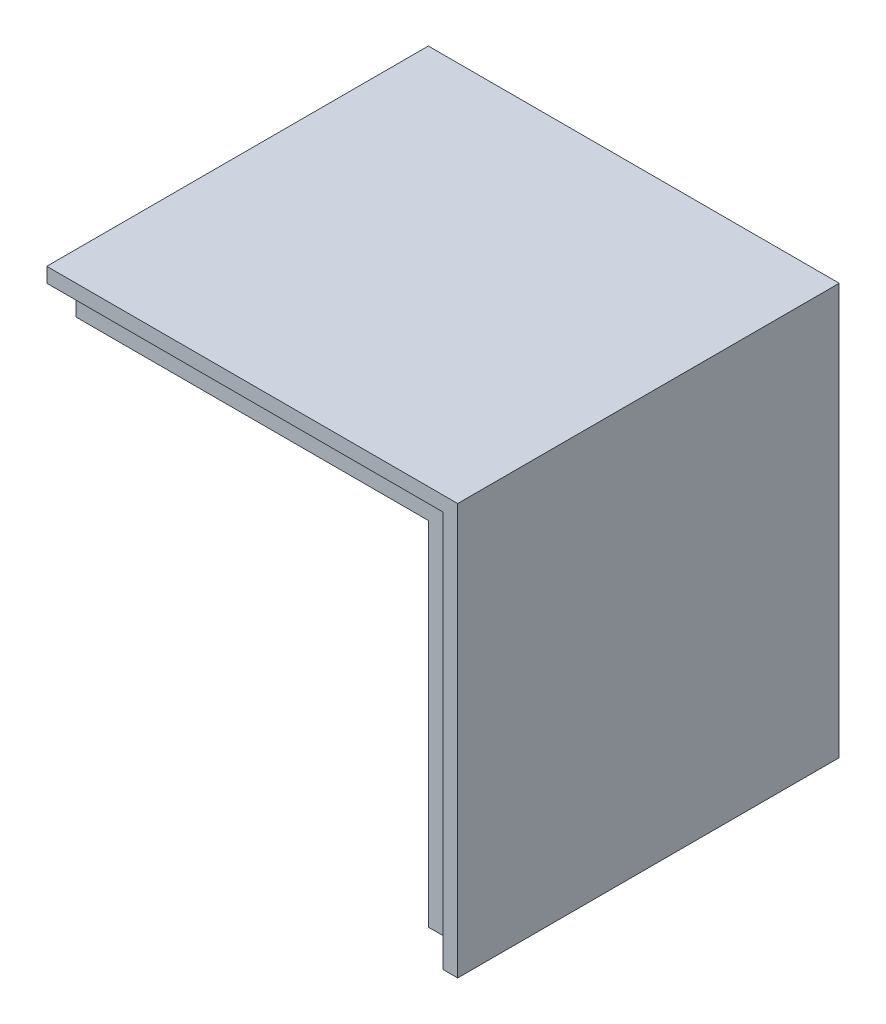
ISO-10303-21;
HEADER;
FILE_DESCRIPTION(('STEP AP214'),'2;1');
FILE_NAME('part.step','',(''),(''),'','','');
FILE_SCHEMA(('AUTOMOTIVE_DESIGN { 1 0 10303 214 1 1 1 1 }'));
ENDSEC;
DATA;
#1=APPLICATION_CONTEXT('core data for automotive mechanical design processes');
#2=APPLICATION_PROTOCOL_DEFINITION('international standard','automotive_design',2000,#1);
#3=PRODUCT_CONTEXT('',#1,'mechanical');
#4=PRODUCT('Part','Part','',(#3));
#5=PRODUCT_RELATED_PRODUCT_CATEGORY('part','',(#4));
#6=PRODUCT_DEFINITION_FORMATION('','',#4);
#7=PRODUCT_DEFINITION_CONTEXT('part definition',#1,'design');
#8=PRODUCT_DEFINITION('design','',#6,#7);
#9=PRODUCT_DEFINITION_SHAPE('','',#8);
#10=(LENGTH_UNIT() NAMED_UNIT(*) SI_UNIT(.MILLI.,.METRE.));
#11=(NAMED_UNIT(*) PLANE_ANGLE_UNIT() SI_UNIT($,.RADIAN.));
#12=(NAMED_UNIT(*) SI_UNIT($,.STERADIAN.) SOLID_ANGLE_UNIT());
#13=UNCERTAINTY_MEASURE_WITH_UNIT(LENGTH_MEASURE(1.E-05),#10,'distance_accuracy_value','');
#14=(GEOMETRIC_REPRESENTATION_CONTEXT(3) GLOBAL_UNCERTAINTY_ASSIGNED_CONTEXT((#13)) GLOBAL_UNIT_ASSIGNED_CONTEXT((#10,
#11,#12)) REPRESENTATION_CONTEXT('',''));
#15=CARTESIAN_POINT('',(0.,0.,0.));
#16=DIRECTION('',(0.,0.,1.));
#17=DIRECTION('',(1.,0.,0.));
#18=AXIS2_PLACEMENT_3D('',#15,#16,#17);
#19=CARTESIAN_POINT('',(-70.,67.5,65.));
#20=DIRECTION('',(1.,0.,0.));
#21=DIRECTION('',(0.,0.,-1.));
#22=AXIS2_PLACEMENT_3D('',#19,#20,#21);
#23=PLANE('',#22);
#24=DIRECTION('',(0.,-1.,0.));
#25=VECTOR('',#24,1.);
#26=CARTESIAN_POINT('',(-70.,67.5,-65.));
#27=LINE('',#26,#25);
#28=CARTESIAN_POINT('',(-70.,72.5,-65.));
#29=VERTEX_POINT('',#28);
#30=CARTESIAN_POINT('',(-70.,67.5,-65.));
#31=VERTEX_POINT('',#30);
#32=EDGE_CURVE('E169',#29,#31,#27,.T.);
#33=ORIENTED_EDGE('',*,*,#32,.T.);
#34=DIRECTION('',(0.,0.,-1.));
#35=VECTOR('',#34,1.);
#36=CARTESIAN_POINT('',(-70.,67.5,65.));
#37=LINE('',#36,#35);
#38=CARTESIAN_POINT('',(-70.,67.5,65.));
#39=VERTEX_POINT('',#38);
#40=EDGE_CURVE('E11',#39,#31,#37,.T.);
#41=ORIENTED_EDGE('',*,*,#40,.F.);
#42=DIRECTION('',(0.,-1.,0.));
#43=VECTOR('',#42,1.);
#44=CARTESIAN_POINT('',(-70.,67.5,65.));
#45=LINE('',#44,#43);
#46=CARTESIAN_POINT('',(-70.,72.5,65.));
#47=VERTEX_POINT('',#46);
#48=EDGE_CURVE('E170',#47,#39,#45,.T.);
#49=ORIENTED_EDGE('',*,*,#48,.F.);
#50=DIRECTION('',(0.,0.,-1.));
#51=VECTOR('',#50,1.);
#52=CARTESIAN_POINT('',(-70.,72.5,65.));
#53=LINE('',#52,#51);
#54=EDGE_CURVE('E184',#47,#29,#53,.T.);
#55=ORIENTED_EDGE('',*,*,#54,.T.);
#56=EDGE_LOOP('',(#33,#41,#49,#55));
#57=FACE_BOUND('',#56,.T.);
#58=ADVANCED_FACE('F33',(#57),#23,.F.);
#59=CARTESIAN_POINT('',(65.,67.5,65.));
#60=DIRECTION('',(0.,1.,0.));
#61=DIRECTION('',(-1.,0.,0.));
#62=AXIS2_PLACEMENT_3D('',#59,#60,#61);
#63=PLANE('',#62);
#64=DIRECTION('',(0.,0.,-1.));
#65=VECTOR('',#64,1.);
#66=CARTESIAN_POINT('',(-65.,67.5,60.));
#67=LINE('',#66,#65);
#68=CARTESIAN_POINT('',(-65.,67.5,60.));
#69=VERTEX_POINT('',#68);
#70=CARTESIAN_POINT('',(-65.,67.5,-60.));
#71=VERTEX_POINT('',#70);
#72=EDGE_CURVE('E47',#69,#71,#67,.T.);
#73=ORIENTED_EDGE('',*,*,#72,.F.);
#74=DIRECTION('',(-1.,0.,0.));
#75=VECTOR('',#74,1.);
#76=CARTESIAN_POINT('',(65.,67.5,60.));
#77=LINE('',#76,#75);
#78=CARTESIAN_POINT('',(65.,67.5,60.));
#79=VERTEX_POINT('',#78);
#80=EDGE_CURVE('E127',#79,#69,#77,.T.);
#81=ORIENTED_EDGE('',*,*,#80,.F.);
#82=DIRECTION('',(0.,0.,-1.));
#83=VECTOR('',#82,1.);
#84=CARTESIAN_POINT('',(65.,67.5,65.));
#85=LINE('',#84,#83);
#86=CARTESIAN_POINT('',(65.,67.5,65.));
#87=VERTEX_POINT('',#86);
#88=EDGE_CURVE('E40',#87,#79,#85,.T.);
#89=ORIENTED_EDGE('',*,*,#88,.F.);
#90=DIRECTION('',(1.,0.,0.));
#91=VECTOR('',#90,1.);
#92=CARTESIAN_POINT('',(65.,67.5,65.));
#93=LINE('',#92,#91);
#94=EDGE_CURVE('E173',#39,#87,#93,.T.);
#95=ORIENTED_EDGE('',*,*,#94,.F.);
#96=ORIENTED_EDGE('',*,*,#40,.T.);
#97=DIRECTION('',(1.,0.,0.));
#98=VECTOR('',#97,1.);
#99=CARTESIAN_POINT('',(65.,67.5,-65.));
#100=LINE('',#99,#98);
#101=CARTESIAN_POINT('',(65.,67.5,-65.));
#102=VERTEX_POINT('',#101);
#103=EDGE_CURVE('E187',#31,#102,#100,.T.);
#104=ORIENTED_EDGE('',*,*,#103,.T.);
#105=CARTESIAN_POINT('',(65.,67.5,-60.));
#106=VERTEX_POINT('',#105);
#107=EDGE_CURVE('E207',#106,#102,#85,.T.);
#108=ORIENTED_EDGE('',*,*,#107,.F.);
#109=DIRECTION('',(-1.,0.,0.));
#110=VECTOR('',#109,1.);
#111=CARTESIAN_POINT('',(65.,67.5,-60.));
#112=LINE('',#111,#110);
#113=EDGE_CURVE('E52',#106,#71,#112,.T.);
#114=ORIENTED_EDGE('',*,*,#113,.T.);
#115=EDGE_LOOP('',(#73,#81,#89,#95,#96,#104,#108,#114));
#116=FACE_BOUND('',#115,.T.);
#117=ADVANCED_FACE('F216',(#116),#63,.F.);
#118=CARTESIAN_POINT('',(65.,-67.5,65.));
#119=DIRECTION('',(1.,0.,0.));
#120=DIRECTION('',(0.,0.,-1.));
#121=AXIS2_PLACEMENT_3D('',#118,#119,#120);
#122=PLANE('',#121);
#123=ORIENTED_EDGE('',*,*,#88,.T.);
#124=DIRECTION('',(0.,1.,0.));
#125=VECTOR('',#124,1.);
#126=CARTESIAN_POINT('',(65.,-62.5,60.));
#127=LINE('',#126,#125);
#128=CARTESIAN_POINT('',(65.,-62.5,60.));
#129=VERTEX_POINT('',#128);
#130=EDGE_CURVE('E149',#129,#79,#127,.T.);
#131=ORIENTED_EDGE('',*,*,#130,.F.);
#132=DIRECTION('',(0.,0.,-1.));
#133=VECTOR('',#132,1.);
#134=CARTESIAN_POINT('',(65.,-62.5,60.));
#135=LINE('',#134,#133);
#136=CARTESIAN_POINT('',(65.,-62.5,-60.));
#137=VERTEX_POINT('',#136);
#138=EDGE_CURVE('E151',#129,#137,#135,.T.);
#139=ORIENTED_EDGE('',*,*,#138,.T.);
#140=DIRECTION('',(0.,1.,0.));
#141=VECTOR('',#140,1.);
#142=CARTESIAN_POINT('',(65.,-62.5,-60.));
#143=LINE('',#142,#141);
#144=EDGE_CURVE('E161',#137,#106,#143,.T.);
#145=ORIENTED_EDGE('',*,*,#144,.T.);
#146=ORIENTED_EDGE('',*,*,#107,.T.);
#147=DIRECTION('',(0.,-1.,0.));
#148=VECTOR('',#147,1.);
#149=CARTESIAN_POINT('',(65.,-67.5,-65.));
#150=LINE('',#149,#148);
#151=CARTESIAN_POINT('',(65.,-67.5,-65.));
#152=VERTEX_POINT('',#151);
#153=EDGE_CURVE('E190',#102,#152,#150,.T.);
#154=ORIENTED_EDGE('',*,*,#153,.T.);
#155=DIRECTION('',(0.,0.,-1.));
#156=VECTOR('',#155,1.);
#157=CARTESIAN_POINT('',(65.,-67.5,65.));
#158=LINE('',#157,#156);
#159=CARTESIAN_POINT('',(65.,-67.5,65.));
#160=VERTEX_POINT('',#159);
#161=EDGE_CURVE('E205',#160,#152,#158,.T.);
#162=ORIENTED_EDGE('',*,*,#161,.F.);
#163=DIRECTION('',(0.,-1.,0.));
#164=VECTOR('',#163,1.);
#165=CARTESIAN_POINT('',(65.,-67.5,65.));
#166=LINE('',#165,#164);
#167=EDGE_CURVE('E176',#87,#160,#166,.T.);
#168=ORIENTED_EDGE('',*,*,#167,.F.);
#169=EDGE_LOOP('',(#123,#131,#139,#145,#146,#154,#162,#168));
#170=FACE_BOUND('',#169,.T.);
#171=ADVANCED_FACE('F212',(#170),#122,.F.);
#172=CARTESIAN_POINT('',(70.,-67.5,65.));
#173=DIRECTION('',(0.,1.,0.));
#174=DIRECTION('',(0.,0.,1.));
#175=AXIS2_PLACEMENT_3D('',#172,#173,#174);
#176=PLANE('',#175);
#177=DIRECTION('',(1.,0.,0.));
#178=VECTOR('',#177,1.);
#179=CARTESIAN_POINT('',(70.,-67.5,-65.));
#180=LINE('',#179,#178);
#181=CARTESIAN_POINT('',(70.,-67.5,-65.));
#182=VERTEX_POINT('',#181);
#183=EDGE_CURVE('E192',#152,#182,#180,.T.);
#184=ORIENTED_EDGE('',*,*,#183,.T.);
#185=DIRECTION('',(0.,0.,-1.));
#186=VECTOR('',#185,1.);
#187=CARTESIAN_POINT('',(70.,-67.5,65.));
#188=LINE('',#187,#186);
#189=CARTESIAN_POINT('',(70.,-67.5,65.));
#190=VERTEX_POINT('',#189);
#191=EDGE_CURVE('E202',#190,#182,#188,.T.);
#192=ORIENTED_EDGE('',*,*,#191,.F.);
#193=DIRECTION('',(1.,0.,0.));
#194=VECTOR('',#193,1.);
#195=CARTESIAN_POINT('',(70.,-67.5,65.));
#196=LINE('',#195,#194);
#197=EDGE_CURVE('E178',#160,#190,#196,.T.);
#198=ORIENTED_EDGE('',*,*,#197,.F.);
#199=ORIENTED_EDGE('',*,*,#161,.T.);
#200=EDGE_LOOP('',(#184,#192,#198,#199));
#201=FACE_BOUND('',#200,.T.);
#202=ADVANCED_FACE('F226',(#201),#176,.F.);
#203=CARTESIAN_POINT('',(70.,72.5,65.));
#204=DIRECTION('',(-1.,0.,0.));
#205=DIRECTION('',(0.,0.,1.));
#206=AXIS2_PLACEMENT_3D('',#203,#204,#205);
#207=PLANE('',#206);
#208=DIRECTION('',(0.,1.,0.));
#209=VECTOR('',#208,1.);
#210=CARTESIAN_POINT('',(70.,72.5,-65.));
#211=LINE('',#210,#209);
#212=CARTESIAN_POINT('',(70.,72.5,-65.));
#213=VERTEX_POINT('',#212);
#214=EDGE_CURVE('E194',#182,#213,#211,.T.);
#215=ORIENTED_EDGE('',*,*,#214,.T.);
#216=DIRECTION('',(0.,0.,-1.));
#217=VECTOR('',#216,1.);
#218=CARTESIAN_POINT('',(70.,72.5,65.));
#219=LINE('',#218,#217);
#220=CARTESIAN_POINT('',(70.,72.5,65.));
#221=VERTEX_POINT('',#220);
#222=EDGE_CURVE('E199',#221,#213,#219,.T.);
#223=ORIENTED_EDGE('',*,*,#222,.F.);
#224=DIRECTION('',(0.,1.,0.));
#225=VECTOR('',#224,1.);
#226=CARTESIAN_POINT('',(70.,72.5,65.));
#227=LINE('',#226,#225);
#228=EDGE_CURVE('E180',#190,#221,#227,.T.);
#229=ORIENTED_EDGE('',*,*,#228,.F.);
#230=ORIENTED_EDGE('',*,*,#191,.T.);
#231=EDGE_LOOP('',(#215,#223,#229,#230));
#232=FACE_BOUND('',#231,.T.);
#233=ADVANCED_FACE('F230',(#232),#207,.F.);
#234=CARTESIAN_POINT('',(-70.,72.5,65.));
#235=DIRECTION('',(0.,-1.,0.));
#236=DIRECTION('',(1.,0.,0.));
#237=AXIS2_PLACEMENT_3D('',#234,#235,#236);
#238=PLANE('',#237);
#239=DIRECTION('',(-1.,0.,0.));
#240=VECTOR('',#239,1.);
#241=CARTESIAN_POINT('',(-70.,72.5,-65.));
#242=LINE('',#241,#240);
#243=EDGE_CURVE('E174',#213,#29,#242,.T.);
#244=ORIENTED_EDGE('',*,*,#243,.T.);
#245=ORIENTED_EDGE('',*,*,#54,.F.);
#246=DIRECTION('',(-1.,0.,0.));
#247=VECTOR('',#246,1.);
#248=CARTESIAN_POINT('',(-70.,72.5,65.));
#249=LINE('',#248,#247);
#250=EDGE_CURVE('E182',#221,#47,#249,.T.);
#251=ORIENTED_EDGE('',*,*,#250,.F.);
#252=ORIENTED_EDGE('',*,*,#222,.T.);
#253=EDGE_LOOP('',(#244,#245,#251,#252));
#254=FACE_BOUND('',#253,.T.);
#255=ADVANCED_FACE('F239',(#254),#238,.F.);
#256=CARTESIAN_POINT('',(0.,0.,65.));
#257=DIRECTION('',(0.,0.,-1.));
#258=DIRECTION('',(-1.,0.,0.));
#259=AXIS2_PLACEMENT_3D('',#256,#257,#258);
#260=PLANE('',#259);
#261=ORIENTED_EDGE('',*,*,#48,.T.);
#262=ORIENTED_EDGE('',*,*,#94,.T.);
#263=ORIENTED_EDGE('',*,*,#167,.T.);
#264=ORIENTED_EDGE('',*,*,#197,.T.);
#265=ORIENTED_EDGE('',*,*,#228,.T.);
#266=ORIENTED_EDGE('',*,*,#250,.T.);
#267=EDGE_LOOP('',(#261,#262,#263,#264,#265,#266));
#268=FACE_BOUND('',#267,.T.);
#269=ADVANCED_FACE('F234',(#268),#260,.F.);
#270=CARTESIAN_POINT('',(0.,0.,-65.));
#271=DIRECTION('',(0.,0.,-1.));
#272=DIRECTION('',(-1.,0.,0.));
#273=AXIS2_PLACEMENT_3D('',#270,#271,#272);
#274=PLANE('',#273);
#275=ORIENTED_EDGE('',*,*,#32,.F.);
#276=ORIENTED_EDGE('',*,*,#243,.F.);
#277=ORIENTED_EDGE('',*,*,#214,.F.);
#278=ORIENTED_EDGE('',*,*,#183,.F.);
#279=ORIENTED_EDGE('',*,*,#153,.F.);
#280=ORIENTED_EDGE('',*,*,#103,.F.);
#281=EDGE_LOOP('',(#275,#276,#277,#278,#279,#280));
#282=FACE_BOUND('',#281,.T.);
#283=ADVANCED_FACE('F221',(#282),#274,.T.);
#284=CARTESIAN_POINT('',(-65.,67.5,60.));
#285=DIRECTION('',(1.,0.,0.));
#286=DIRECTION('',(0.,0.,-1.));
#287=AXIS2_PLACEMENT_3D('',#284,#285,#286);
#288=PLANE('',#287);
#289=DIRECTION('',(0.,-1.,0.));
#290=VECTOR('',#289,1.);
#291=CARTESIAN_POINT('',(-65.,67.5,-60.));
#292=LINE('',#291,#290);
#293=CARTESIAN_POINT('',(-65.,57.5,-60.));
#294=VERTEX_POINT('',#293);
#295=EDGE_CURVE('E133',#71,#294,#292,.T.);
#296=ORIENTED_EDGE('',*,*,#295,.T.);
#297=DIRECTION('',(0.,0.,-1.));
#298=VECTOR('',#297,1.);
#299=CARTESIAN_POINT('',(-65.,57.5,60.));
#300=LINE('',#299,#298);
#301=CARTESIAN_POINT('',(-65.,57.5,60.));
#302=VERTEX_POINT('',#301);
#303=EDGE_CURVE('E131',#302,#294,#300,.T.);
#304=ORIENTED_EDGE('',*,*,#303,.F.);
#305=DIRECTION('',(0.,-1.,0.));
#306=VECTOR('',#305,1.);
#307=CARTESIAN_POINT('',(-65.,67.5,60.));
#308=LINE('',#307,#306);
#309=EDGE_CURVE('E120',#69,#302,#308,.T.);
#310=ORIENTED_EDGE('',*,*,#309,.F.);
#311=ORIENTED_EDGE('',*,*,#72,.T.);
#312=EDGE_LOOP('',(#296,#304,#310,#311));
#313=FACE_BOUND('',#312,.T.);
#314=ADVANCED_FACE('F132',(#313),#288,.F.);
#315=CARTESIAN_POINT('',(-65.,57.5,60.));
#316=DIRECTION('',(0.,1.,0.));
#317=DIRECTION('',(-1.,0.,0.));
#318=AXIS2_PLACEMENT_3D('',#315,#316,#317);
#319=PLANE('',#318);
#320=DIRECTION('',(1.,0.,0.));
#321=VECTOR('',#320,1.);
#322=CARTESIAN_POINT('',(-65.,57.5,-60.));
#323=LINE('',#322,#321);
#324=CARTESIAN_POINT('',(55.,57.5,-60.));
#325=VERTEX_POINT('',#324);
#326=EDGE_CURVE('E154',#294,#325,#323,.T.);
#327=ORIENTED_EDGE('',*,*,#326,.T.);
#328=DIRECTION('',(0.,0.,-1.));
#329=VECTOR('',#328,1.);
#330=CARTESIAN_POINT('',(55.,57.5,60.));
#331=LINE('',#330,#329);
#332=CARTESIAN_POINT('',(55.,57.5,60.));
#333=VERTEX_POINT('',#332);
#334=EDGE_CURVE('E136',#333,#325,#331,.T.);
#335=ORIENTED_EDGE('',*,*,#334,.F.);
#336=DIRECTION('',(1.,0.,0.));
#337=VECTOR('',#336,1.);
#338=CARTESIAN_POINT('',(-65.,57.5,60.));
#339=LINE('',#338,#337);
#340=EDGE_CURVE('E124',#302,#333,#339,.T.);
#341=ORIENTED_EDGE('',*,*,#340,.F.);
#342=ORIENTED_EDGE('',*,*,#303,.T.);
#343=EDGE_LOOP('',(#327,#335,#341,#342));
#344=FACE_BOUND('',#343,.T.);
#345=ADVANCED_FACE('F138',(#344),#319,.F.);
#346=CARTESIAN_POINT('',(55.,57.5,60.));
#347=DIRECTION('',(1.,0.,0.));
#348=DIRECTION('',(0.,1.,0.));
#349=AXIS2_PLACEMENT_3D('',#346,#347,#348);
#350=PLANE('',#349);
#351=DIRECTION('',(0.,-1.,0.));
#352=VECTOR('',#351,1.);
#353=CARTESIAN_POINT('',(55.,57.5,-60.));
#354=LINE('',#353,#352);
#355=CARTESIAN_POINT('',(55.,-62.5,-60.));
#356=VERTEX_POINT('',#355);
#357=EDGE_CURVE('E156',#325,#356,#354,.T.);
#358=ORIENTED_EDGE('',*,*,#357,.T.);
#359=DIRECTION('',(0.,0.,-1.));
#360=VECTOR('',#359,1.);
#361=CARTESIAN_POINT('',(55.,-62.5,60.));
#362=LINE('',#361,#360);
#363=CARTESIAN_POINT('',(55.,-62.5,60.));
#364=VERTEX_POINT('',#363);
#365=EDGE_CURVE('E164',#364,#356,#362,.T.);
#366=ORIENTED_EDGE('',*,*,#365,.F.);
#367=DIRECTION('',(0.,-1.,0.));
#368=VECTOR('',#367,1.);
#369=CARTESIAN_POINT('',(55.,57.5,60.));
#370=LINE('',#369,#368);
#371=EDGE_CURVE('E141',#333,#364,#370,.T.);
#372=ORIENTED_EDGE('',*,*,#371,.F.);
#373=ORIENTED_EDGE('',*,*,#334,.T.);
#374=EDGE_LOOP('',(#358,#366,#372,#373));
#375=FACE_BOUND('',#374,.T.);
#376=ADVANCED_FACE('F310',(#375),#350,.F.);
#377=CARTESIAN_POINT('',(55.,-62.5,60.));
#378=DIRECTION('',(0.,1.,0.));
#379=DIRECTION('',(0.,0.,1.));
#380=AXIS2_PLACEMENT_3D('',#377,#378,#379);
#381=PLANE('',#380);
#382=DIRECTION('',(1.,0.,0.));
#383=VECTOR('',#382,1.);
#384=CARTESIAN_POINT('',(55.,-62.5,-60.));
#385=LINE('',#384,#383);
#386=EDGE_CURVE('E158',#356,#137,#385,.T.);
#387=ORIENTED_EDGE('',*,*,#386,.T.);
#388=ORIENTED_EDGE('',*,*,#138,.F.);
#389=DIRECTION('',(1.,0.,0.));
#390=VECTOR('',#389,1.);
#391=CARTESIAN_POINT('',(55.,-62.5,60.));
#392=LINE('',#391,#390);
#393=EDGE_CURVE('E143',#364,#129,#392,.T.);
#394=ORIENTED_EDGE('',*,*,#393,.F.);
#395=ORIENTED_EDGE('',*,*,#365,.T.);
#396=EDGE_LOOP('',(#387,#388,#394,#395));
#397=FACE_BOUND('',#396,.T.);
#398=ADVANCED_FACE('F319',(#397),#381,.F.);
#399=CARTESIAN_POINT('',(0.,0.,60.));
#400=DIRECTION('',(0.,0.,1.));
#401=DIRECTION('',(1.,0.,0.));
#402=AXIS2_PLACEMENT_3D('',#399,#400,#401);
#403=PLANE('',#402);
#404=ORIENTED_EDGE('',*,*,#80,.T.);
#405=ORIENTED_EDGE('',*,*,#309,.T.);
#406=ORIENTED_EDGE('',*,*,#340,.T.);
#407=ORIENTED_EDGE('',*,*,#371,.T.);
#408=ORIENTED_EDGE('',*,*,#393,.T.);
#409=ORIENTED_EDGE('',*,*,#130,.T.);
#410=EDGE_LOOP('',(#404,#405,#406,#407,#408,#409));
#411=FACE_BOUND('',#410,.T.);
#412=ADVANCED_FACE('F122',(#411),#403,.T.);
#413=CARTESIAN_POINT('',(0.,0.,-60.));
#414=DIRECTION('',(0.,0.,1.));
#415=DIRECTION('',(1.,0.,0.));
#416=AXIS2_PLACEMENT_3D('',#413,#414,#415);
#417=PLANE('',#416);
#418=ORIENTED_EDGE('',*,*,#113,.F.);
#419=ORIENTED_EDGE('',*,*,#144,.F.);
#420=ORIENTED_EDGE('',*,*,#386,.F.);
#421=ORIENTED_EDGE('',*,*,#357,.F.);
#422=ORIENTED_EDGE('',*,*,#326,.F.);
#423=ORIENTED_EDGE('',*,*,#295,.F.);
#424=EDGE_LOOP('',(#418,#419,#420,#421,#422,#423));
#425=FACE_BOUND('',#424,.T.);
#426=ADVANCED_FACE('F338',(#425),#417,.F.);
#427=CLOSED_SHELL('',(#58,#117,#171,#202,#233,#255,#269,#283,#314,#345,#376,#398,#412,#426));
#428=MANIFOLD_SOLID_BREP('B2',#427);
#429=ADVANCED_BREP_SHAPE_REPRESENTATION('',(#18,#428),#14);
#430=SHAPE_DEFINITION_REPRESENTATION(#9,#429);
ENDSEC;
END-ISO-10303-21;
